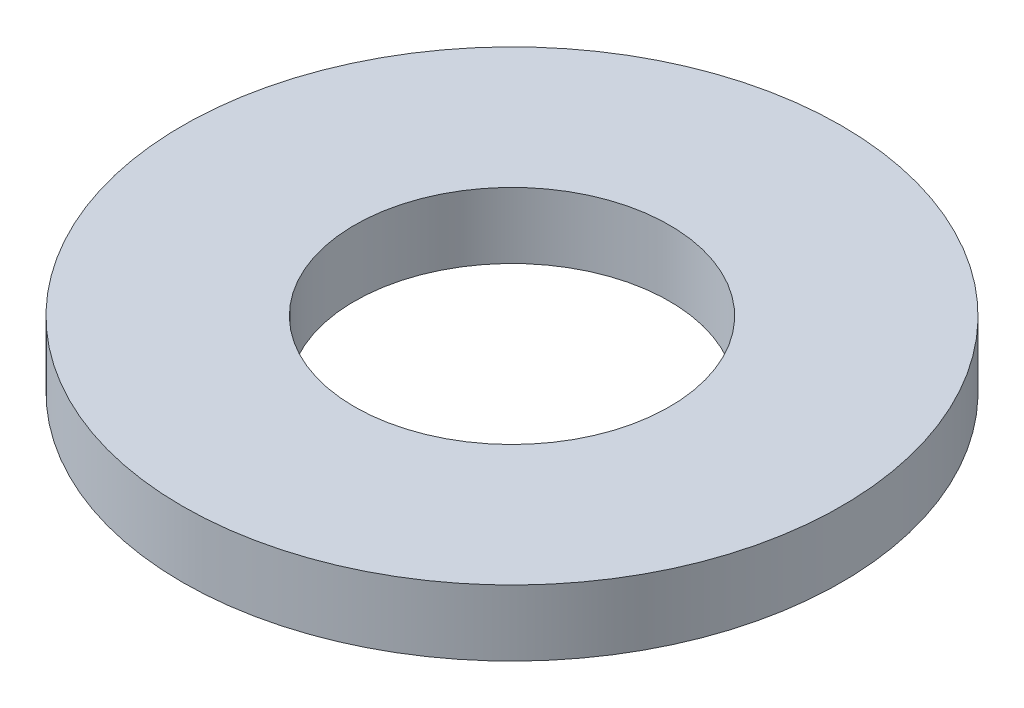
ISO-10303-21;
HEADER;
FILE_DESCRIPTION(('STEP AP214'),'2;1');
FILE_NAME('part.step','',(''),(''),'','','');
FILE_SCHEMA(('AUTOMOTIVE_DESIGN { 1 0 10303 214 1 1 1 1 }'));
ENDSEC;
DATA;
#1=APPLICATION_CONTEXT('core data for automotive mechanical design processes');
#2=APPLICATION_PROTOCOL_DEFINITION('international standard','automotive_design',2000,#1);
#3=PRODUCT_CONTEXT('',#1,'mechanical');
#4=PRODUCT('Part','Part','',(#3));
#5=PRODUCT_RELATED_PRODUCT_CATEGORY('part','',(#4));
#6=PRODUCT_DEFINITION_FORMATION('','',#4);
#7=PRODUCT_DEFINITION_CONTEXT('part definition',#1,'design');
#8=PRODUCT_DEFINITION('design','',#6,#7);
#9=PRODUCT_DEFINITION_SHAPE('','',#8);
#10=(LENGTH_UNIT() NAMED_UNIT(*) SI_UNIT(.MILLI.,.METRE.));
#11=(NAMED_UNIT(*) PLANE_ANGLE_UNIT() SI_UNIT($,.RADIAN.));
#12=(NAMED_UNIT(*) SI_UNIT($,.STERADIAN.) SOLID_ANGLE_UNIT());
#13=UNCERTAINTY_MEASURE_WITH_UNIT(LENGTH_MEASURE(1.E-05),#10,'distance_accuracy_value','');
#14=(GEOMETRIC_REPRESENTATION_CONTEXT(3) GLOBAL_UNCERTAINTY_ASSIGNED_CONTEXT((#13)) GLOBAL_UNIT_ASSIGNED_CONTEXT((#10,
#11,#12)) REPRESENTATION_CONTEXT('',''));
#15=CARTESIAN_POINT('',(0.,0.,0.));
#16=DIRECTION('',(0.,0.,1.));
#17=DIRECTION('',(1.,0.,0.));
#18=AXIS2_PLACEMENT_3D('',#15,#16,#17);
#19=CARTESIAN_POINT('',(0.,0.9,0.));
#20=DIRECTION('',(0.,1.,0.));
#21=DIRECTION('',(0.,0.,1.));
#22=AXIS2_PLACEMENT_3D('',#19,#20,#21);
#23=PLANE('',#22);
#24=CARTESIAN_POINT('',(0.,0.9,0.));
#25=DIRECTION('',(0.,1.,0.));
#26=DIRECTION('',(0.,0.,1.));
#27=AXIS2_PLACEMENT_3D('',#24,#25,#26);
#28=CIRCLE('',#27,4.5);
#29=CARTESIAN_POINT('',(0.,0.9,4.5));
#30=VERTEX_POINT('',#29);
#31=EDGE_CURVE('E10',#30,#30,#28,.T.);
#32=ORIENTED_EDGE('',*,*,#31,.T.);
#33=EDGE_LOOP('',(#32));
#34=FACE_BOUND('',#33,.T.);
#35=CARTESIAN_POINT('',(0.,0.9,0.));
#36=DIRECTION('',(0.,1.,0.));
#37=DIRECTION('',(0.,0.,1.));
#38=AXIS2_PLACEMENT_3D('',#35,#36,#37);
#39=CIRCLE('',#38,2.15);
#40=CARTESIAN_POINT('',(0.,0.9,2.15));
#41=VERTEX_POINT('',#40);
#42=EDGE_CURVE('E49',#41,#41,#39,.T.);
#43=ORIENTED_EDGE('',*,*,#42,.F.);
#44=EDGE_LOOP('',(#43));
#45=FACE_BOUND('',#44,.T.);
#46=ADVANCED_FACE('F35',(#34,#45),#23,.T.);
#47=CARTESIAN_POINT('',(0.,0.,0.));
#48=DIRECTION('',(0.,1.,0.));
#49=DIRECTION('',(0.,0.,1.));
#50=AXIS2_PLACEMENT_3D('',#47,#48,#49);
#51=PLANE('',#50);
#52=CARTESIAN_POINT('',(0.,0.,0.));
#53=DIRECTION('',(0.,1.,0.));
#54=DIRECTION('',(0.,0.,1.));
#55=AXIS2_PLACEMENT_3D('',#52,#53,#54);
#56=CIRCLE('',#55,4.5);
#57=CARTESIAN_POINT('',(0.,0.,4.5));
#58=VERTEX_POINT('',#57);
#59=EDGE_CURVE('E39',#58,#58,#56,.T.);
#60=ORIENTED_EDGE('',*,*,#59,.F.);
#61=EDGE_LOOP('',(#60));
#62=FACE_BOUND('',#61,.T.);
#63=CARTESIAN_POINT('',(0.,0.,0.));
#64=DIRECTION('',(0.,1.,0.));
#65=DIRECTION('',(0.,0.,1.));
#66=AXIS2_PLACEMENT_3D('',#63,#64,#65);
#67=CIRCLE('',#66,2.15);
#68=CARTESIAN_POINT('',(0.,0.,2.15));
#69=VERTEX_POINT('',#68);
#70=EDGE_CURVE('E51',#69,#69,#67,.T.);
#71=ORIENTED_EDGE('',*,*,#70,.T.);
#72=EDGE_LOOP('',(#71));
#73=FACE_BOUND('',#72,.T.);
#74=ADVANCED_FACE('F62',(#62,#73),#51,.F.);
#75=CARTESIAN_POINT('',(0.,0.9,0.));
#76=DIRECTION('',(0.,-1.,0.));
#77=DIRECTION('',(0.,0.,-1.));
#78=AXIS2_PLACEMENT_3D('',#75,#76,#77);
#79=CYLINDRICAL_SURFACE('',#78,4.5);
#80=ORIENTED_EDGE('',*,*,#31,.F.);
#81=EDGE_LOOP('',(#80));
#82=FACE_BOUND('',#81,.T.);
#83=ORIENTED_EDGE('',*,*,#59,.T.);
#84=EDGE_LOOP('',(#83));
#85=FACE_BOUND('',#84,.T.);
#86=ADVANCED_FACE('F37',(#82,#85),#79,.T.);
#87=CARTESIAN_POINT('',(0.,0.9,0.));
#88=DIRECTION('',(0.,-1.,0.));
#89=DIRECTION('',(0.,0.,-1.));
#90=AXIS2_PLACEMENT_3D('',#87,#88,#89);
#91=CYLINDRICAL_SURFACE('',#90,2.15);
#92=ORIENTED_EDGE('',*,*,#42,.T.);
#93=EDGE_LOOP('',(#92));
#94=FACE_BOUND('',#93,.T.);
#95=ORIENTED_EDGE('',*,*,#70,.F.);
#96=EDGE_LOOP('',(#95));
#97=FACE_BOUND('',#96,.T.);
#98=ADVANCED_FACE('F58',(#94,#97),#91,.F.);
#99=CLOSED_SHELL('',(#46,#74,#86,#98));
#100=MANIFOLD_SOLID_BREP('B2',#99);
#101=ADVANCED_BREP_SHAPE_REPRESENTATION('',(#18,#100),#14);
#102=SHAPE_DEFINITION_REPRESENTATION(#9,#101);
ENDSEC;
END-ISO-10303-21;
